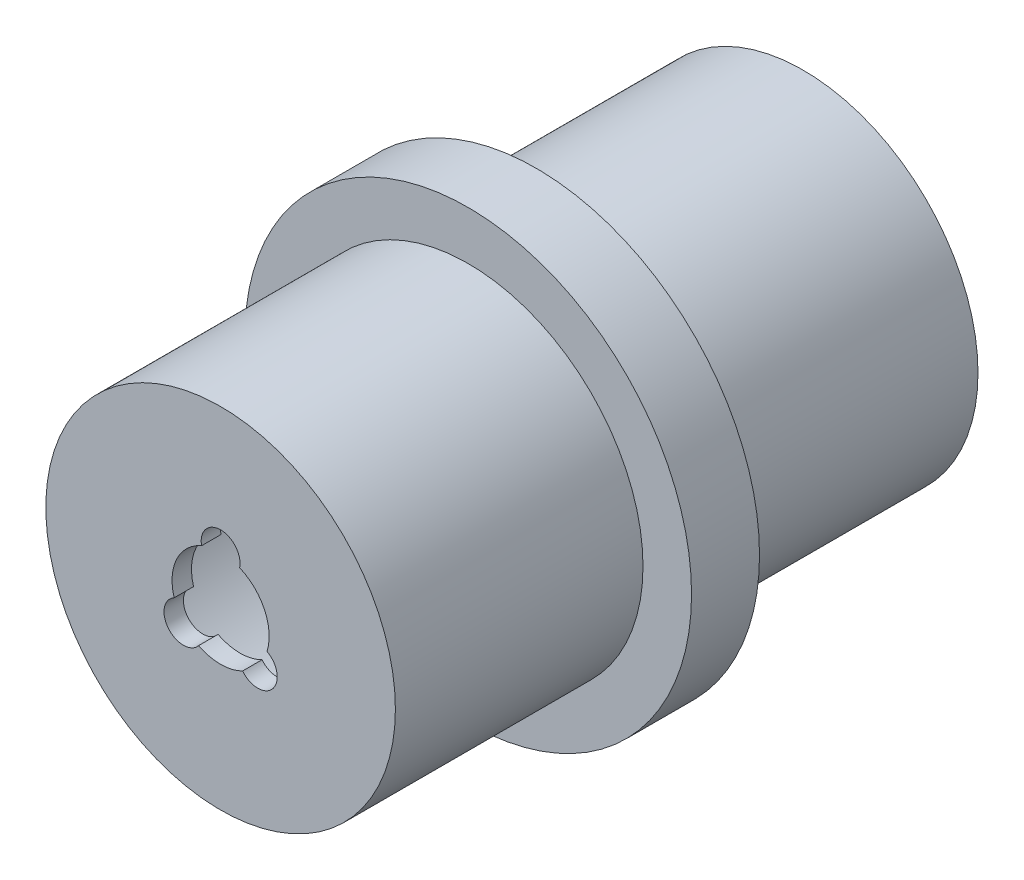
ISO-10303-21;
HEADER;
FILE_DESCRIPTION(('STEP AP214'),'2;1');
FILE_NAME('part.step','',(''),(''),'','','');
FILE_SCHEMA(('AUTOMOTIVE_DESIGN { 1 0 10303 214 1 1 1 1 }'));
ENDSEC;
DATA;
#1=APPLICATION_CONTEXT('core data for automotive mechanical design processes');
#2=APPLICATION_PROTOCOL_DEFINITION('international standard','automotive_design',2000,#1);
#3=PRODUCT_CONTEXT('',#1,'mechanical');
#4=PRODUCT('Part','Part','',(#3));
#5=PRODUCT_RELATED_PRODUCT_CATEGORY('part','',(#4));
#6=PRODUCT_DEFINITION_FORMATION('','',#4);
#7=PRODUCT_DEFINITION_CONTEXT('part definition',#1,'design');
#8=PRODUCT_DEFINITION('design','',#6,#7);
#9=PRODUCT_DEFINITION_SHAPE('','',#8);
#10=(LENGTH_UNIT() NAMED_UNIT(*) SI_UNIT(.MILLI.,.METRE.));
#11=(NAMED_UNIT(*) PLANE_ANGLE_UNIT() SI_UNIT($,.RADIAN.));
#12=(NAMED_UNIT(*) SI_UNIT($,.STERADIAN.) SOLID_ANGLE_UNIT());
#13=UNCERTAINTY_MEASURE_WITH_UNIT(LENGTH_MEASURE(1.E-05),#10,'distance_accuracy_value','');
#14=(GEOMETRIC_REPRESENTATION_CONTEXT(3) GLOBAL_UNCERTAINTY_ASSIGNED_CONTEXT((#13)) GLOBAL_UNIT_ASSIGNED_CONTEXT((#10,
#11,#12)) REPRESENTATION_CONTEXT('',''));
#15=CARTESIAN_POINT('',(0.,0.,0.));
#16=DIRECTION('',(0.,0.,1.));
#17=DIRECTION('',(1.,0.,0.));
#18=AXIS2_PLACEMENT_3D('',#15,#16,#17);
#19=CARTESIAN_POINT('',(0.,0.,1072.38147752167));
#20=DIRECTION('',(0.,0.,1.));
#21=DIRECTION('',(1.,0.,0.));
#22=AXIS2_PLACEMENT_3D('',#19,#20,#21);
#23=CYLINDRICAL_SURFACE('',#22,5.);
#24=CARTESIAN_POINT('',(0.,0.,58.));
#25=DIRECTION('',(0.,0.,1.));
#26=DIRECTION('',(1.,0.,0.));
#27=AXIS2_PLACEMENT_3D('',#24,#25,#26);
#28=CIRCLE('',#27,5.);
#29=CARTESIAN_POINT('',(-2.26420311297507,-4.45795740930687,58.));
#30=VERTEX_POINT('',#29);
#31=CARTESIAN_POINT('',(2.26420311297507,-4.45795740930687,58.));
#32=VERTEX_POINT('',#31);
#33=EDGE_CURVE('E283',#30,#32,#28,.T.);
#34=ORIENTED_EDGE('',*,*,#33,.F.);
#35=DIRECTION('',(0.,0.,1.));
#36=VECTOR('',#35,1.);
#37=CARTESIAN_POINT('',(-2.26420311297507,-4.45795740930687,-0.001000000000001));
#38=LINE('',#37,#36);
#39=CARTESIAN_POINT('',(-2.26420311297507,-4.45795740930687,60.));
#40=VERTEX_POINT('',#39);
#41=EDGE_CURVE('E107',#30,#40,#38,.T.);
#42=ORIENTED_EDGE('',*,*,#41,.T.);
#43=CARTESIAN_POINT('',(0.,0.,60.0000000000001));
#44=DIRECTION('',(0.,0.,1.));
#45=DIRECTION('',(1.,0.,0.));
#46=AXIS2_PLACEMENT_3D('',#43,#44,#45);
#47=CIRCLE('',#46,5.);
#48=CARTESIAN_POINT('',(2.26420311297507,-4.45795740930687,60.));
#49=VERTEX_POINT('',#48);
#50=EDGE_CURVE('E289',#40,#49,#47,.T.);
#51=ORIENTED_EDGE('',*,*,#50,.T.);
#52=DIRECTION('',(0.,0.,1.));
#53=VECTOR('',#52,1.);
#54=CARTESIAN_POINT('',(2.26420311297507,-4.45795740930687,-0.001000000000001));
#55=LINE('',#54,#53);
#56=EDGE_CURVE('E586',#32,#49,#55,.T.);
#57=ORIENTED_EDGE('',*,*,#56,.F.);
#58=EDGE_LOOP('',(#34,#42,#51,#57));
#59=FACE_BOUND('',#58,.T.);
#60=ADVANCED_FACE('F83',(#59),#23,.F.);
#61=CARTESIAN_POINT('',(-1.95959179422654,4.6,60.));
#62=VERTEX_POINT('',#61);
#63=CARTESIAN_POINT('',(-4.78340576371954,-1.45568859980928,60.));
#64=VERTEX_POINT('',#63);
#65=EDGE_CURVE('E273',#62,#64,#47,.T.);
#66=ORIENTED_EDGE('',*,*,#65,.T.);
#67=DIRECTION('',(0.,0.,1.));
#68=VECTOR('',#67,1.);
#69=CARTESIAN_POINT('',(-4.78340576371954,-1.45568859980928,-0.001000000000001));
#70=LINE('',#69,#68);
#71=CARTESIAN_POINT('',(-4.78340576371954,-1.45568859980928,58.));
#72=VERTEX_POINT('',#71);
#73=EDGE_CURVE('E257',#72,#64,#70,.T.);
#74=ORIENTED_EDGE('',*,*,#73,.F.);
#75=CARTESIAN_POINT('',(-1.95959179422654,4.6,58.));
#76=VERTEX_POINT('',#75);
#77=EDGE_CURVE('E271',#76,#72,#28,.T.);
#78=ORIENTED_EDGE('',*,*,#77,.F.);
#79=DIRECTION('',(0.,0.,1.));
#80=VECTOR('',#79,1.);
#81=CARTESIAN_POINT('',(-1.95959179422654,4.6,-0.001000000000001));
#82=LINE('',#81,#80);
#83=EDGE_CURVE('E596',#76,#62,#82,.T.);
#84=ORIENTED_EDGE('',*,*,#83,.T.);
#85=EDGE_LOOP('',(#66,#74,#78,#84));
#86=FACE_BOUND('',#85,.T.);
#87=ADVANCED_FACE('F269',(#86),#23,.F.);
#88=CARTESIAN_POINT('',(0.,0.,1072.38147752167));
#89=DIRECTION('',(0.,0.,1.));
#90=DIRECTION('',(1.,0.,0.));
#91=AXIS2_PLACEMENT_3D('',#88,#89,#90);
#92=CYLINDRICAL_SURFACE('',#91,17.);
#93=CARTESIAN_POINT('',(0.,0.,2.));
#94=DIRECTION('',(0.,0.,1.));
#95=DIRECTION('',(1.,0.,0.));
#96=AXIS2_PLACEMENT_3D('',#93,#94,#95);
#97=CIRCLE('',#96,17.);
#98=CARTESIAN_POINT('',(17.,0.,2.));
#99=VERTEX_POINT('',#98);
#100=EDGE_CURVE('E297',#99,#99,#97,.T.);
#101=ORIENTED_EDGE('',*,*,#100,.F.);
#102=EDGE_LOOP('',(#101));
#103=FACE_BOUND('',#102,.T.);
#104=CARTESIAN_POINT('',(0.,0.,30.));
#105=DIRECTION('',(0.,0.,1.));
#106=DIRECTION('',(1.,0.,0.));
#107=AXIS2_PLACEMENT_3D('',#104,#105,#106);
#108=CIRCLE('',#107,17.);
#109=CARTESIAN_POINT('',(-4.68395766336508,16.3419870458829,30.));
#110=VERTEX_POINT('',#109);
#111=CARTESIAN_POINT('',(4.68395766336508,16.3419870458829,30.));
#112=VERTEX_POINT('',#111);
#113=EDGE_CURVE('E418',#110,#112,#108,.F.);
#114=ORIENTED_EDGE('',*,*,#113,.F.);
#115=DIRECTION('',(0.,0.,1.));
#116=VECTOR('',#115,1.);
#117=CARTESIAN_POINT('',(-4.68395766336508,16.3419870458829,29.));
#118=LINE('',#117,#116);
#119=CARTESIAN_POINT('',(-4.68395766336508,16.3419870458829,29.));
#120=VERTEX_POINT('',#119);
#121=EDGE_CURVE('E342',#120,#110,#118,.T.);
#122=ORIENTED_EDGE('',*,*,#121,.F.);
#123=CARTESIAN_POINT('',(0.,0.,29.));
#124=DIRECTION('',(0.,0.,1.));
#125=DIRECTION('',(1.,0.,0.));
#126=AXIS2_PLACEMENT_3D('',#123,#124,#125);
#127=CIRCLE('',#126,17.);
#128=CARTESIAN_POINT('',(4.68395766336508,16.3419870458829,29.));
#129=VERTEX_POINT('',#128);
#130=EDGE_CURVE('E440',#120,#129,#127,.T.);
#131=ORIENTED_EDGE('',*,*,#130,.T.);
#132=DIRECTION('',(0.,0.,1.));
#133=VECTOR('',#132,1.);
#134=CARTESIAN_POINT('',(4.68395766336508,16.3419870458829,29.));
#135=LINE('',#134,#133);
#136=EDGE_CURVE('E337',#129,#112,#135,.T.);
#137=ORIENTED_EDGE('',*,*,#136,.T.);
#138=EDGE_LOOP('',(#114,#122,#131,#137));
#139=FACE_BOUND('',#138,.T.);
#140=ADVANCED_FACE('F650',(#103,#139),#92,.F.);
#141=CARTESIAN_POINT('',(0.,0.,29.));
#142=DIRECTION('',(0.939692620785896,-0.342020143325703,0.));
#143=DIRECTION('',(0.342020143325703,0.939692620785896,0.));
#144=AXIS2_PLACEMENT_3D('',#141,#142,#143);
#145=PLANE('',#144);
#146=DIRECTION('',(0.342020143325703,0.939692620785896,0.));
#147=VECTOR('',#146,1.);
#148=CARTESIAN_POINT('',(0.,0.,30.));
#149=LINE('',#148,#147);
#150=CARTESIAN_POINT('',(6.49838272318844,17.8541597949323,30.));
#151=VERTEX_POINT('',#150);
#152=CARTESIAN_POINT('',(7.52444315316555,20.67323765729,30.));
#153=VERTEX_POINT('',#152);
#154=EDGE_CURVE('E572',#151,#153,#149,.T.);
#155=ORIENTED_EDGE('',*,*,#154,.T.);
#156=DIRECTION('',(0.,0.,1.));
#157=VECTOR('',#156,1.);
#158=CARTESIAN_POINT('',(7.52444315316555,20.67323765729,29.));
#159=LINE('',#158,#157);
#160=CARTESIAN_POINT('',(7.52444315316555,20.67323765729,29.));
#161=VERTEX_POINT('',#160);
#162=EDGE_CURVE('E352',#161,#153,#159,.T.);
#163=ORIENTED_EDGE('',*,*,#162,.F.);
#164=DIRECTION('',(0.342020143325703,0.939692620785896,0.));
#165=VECTOR('',#164,1.);
#166=CARTESIAN_POINT('',(0.,0.,29.));
#167=LINE('',#166,#165);
#168=CARTESIAN_POINT('',(6.49838272318844,17.8541597949323,29.));
#169=VERTEX_POINT('',#168);
#170=EDGE_CURVE('E433',#169,#161,#167,.T.);
#171=ORIENTED_EDGE('',*,*,#170,.F.);
#172=DIRECTION('',(0.,0.,1.));
#173=VECTOR('',#172,1.);
#174=CARTESIAN_POINT('',(6.49838272318844,17.8541597949323,29.));
#175=LINE('',#174,#173);
#176=EDGE_CURVE('E320',#169,#151,#175,.T.);
#177=ORIENTED_EDGE('',*,*,#176,.T.);
#178=EDGE_LOOP('',(#155,#163,#171,#177));
#179=FACE_BOUND('',#178,.T.);
#180=ADVANCED_FACE('F714',(#179),#145,.F.);
#181=CARTESIAN_POINT('',(0.,0.,29.));
#182=DIRECTION('',(0.,0.,1.));
#183=DIRECTION('',(1.,0.,0.));
#184=AXIS2_PLACEMENT_3D('',#181,#182,#183);
#185=CYLINDRICAL_SURFACE('',#184,19.);
#186=DIRECTION('',(0.,0.,1.));
#187=VECTOR('',#186,1.);
#188=CARTESIAN_POINT('',(-6.49838272317903,17.8541597949354,29.));
#189=LINE('',#188,#187);
#190=CARTESIAN_POINT('',(-6.49838272317903,17.8541597949354,29.));
#191=VERTEX_POINT('',#190);
#192=CARTESIAN_POINT('',(-6.49838272317903,17.8541597949354,30.));
#193=VERTEX_POINT('',#192);
#194=EDGE_CURVE('E362',#191,#193,#189,.T.);
#195=ORIENTED_EDGE('',*,*,#194,.T.);
#196=CARTESIAN_POINT('',(0.,0.,30.));
#197=DIRECTION('',(0.,0.,1.));
#198=DIRECTION('',(1.,0.,0.));
#199=AXIS2_PLACEMENT_3D('',#196,#197,#198);
#200=CIRCLE('',#199,19.);
#201=EDGE_CURVE('E528',#151,#193,#200,.F.);
#202=ORIENTED_EDGE('',*,*,#201,.F.);
#203=ORIENTED_EDGE('',*,*,#176,.F.);
#204=CARTESIAN_POINT('',(0.,0.,29.));
#205=DIRECTION('',(0.,0.,1.));
#206=DIRECTION('',(1.,0.,0.));
#207=AXIS2_PLACEMENT_3D('',#204,#205,#206);
#208=CIRCLE('',#207,19.);
#209=EDGE_CURVE('E419',#169,#191,#208,.F.);
#210=ORIENTED_EDGE('',*,*,#209,.T.);
#211=EDGE_LOOP('',(#195,#202,#203,#210));
#212=FACE_BOUND('',#211,.T.);
#213=ADVANCED_FACE('F704',(#212),#185,.F.);
#214=CARTESIAN_POINT('',(6.36613778460758E-11,2.31708466085675E-11,29.));
#215=DIRECTION('',(0.939692620784855,0.342020143328563,0.));
#216=DIRECTION('',(-0.342020143328563,0.939692620784855,0.));
#217=AXIS2_PLACEMENT_3D('',#214,#215,#216);
#218=PLANE('',#217);
#219=DIRECTION('',(0.,0.,1.));
#220=VECTOR('',#219,1.);
#221=CARTESIAN_POINT('',(-7.52444315316472,20.67323765729,29.));
#222=LINE('',#221,#220);
#223=CARTESIAN_POINT('',(-7.52444315316472,20.67323765729,29.));
#224=VERTEX_POINT('',#223);
#225=CARTESIAN_POINT('',(-7.52444315316472,20.67323765729,30.));
#226=VERTEX_POINT('',#225);
#227=EDGE_CURVE('E357',#224,#226,#222,.T.);
#228=ORIENTED_EDGE('',*,*,#227,.T.);
#229=DIRECTION('',(-0.342020143328563,0.939692620784855,0.));
#230=VECTOR('',#229,1.);
#231=CARTESIAN_POINT('',(6.36613778460758E-11,2.31708466085675E-11,30.));
#232=LINE('',#231,#230);
#233=EDGE_CURVE('E559',#193,#226,#232,.T.);
#234=ORIENTED_EDGE('',*,*,#233,.F.);
#235=ORIENTED_EDGE('',*,*,#194,.F.);
#236=DIRECTION('',(-0.342020143328563,0.939692620784855,0.));
#237=VECTOR('',#236,1.);
#238=CARTESIAN_POINT('',(6.36613778460758E-11,2.31708466085675E-11,29.));
#239=LINE('',#238,#237);
#240=EDGE_CURVE('E426',#191,#224,#239,.T.);
#241=ORIENTED_EDGE('',*,*,#240,.T.);
#242=EDGE_LOOP('',(#228,#234,#235,#241));
#243=FACE_BOUND('',#242,.T.);
#244=ADVANCED_FACE('F708',(#243),#218,.T.);
#245=CARTESIAN_POINT('',(-1.,19.9724758914095,29.));
#246=CARTESIAN_POINT('',(-1.83751743884076,19.9724758914095,29.));
#247=CARTESIAN_POINT('',(-3.40070254752872,17.6066170470149,29.));
#248=CARTESIAN_POINT('',(-4.50524300138782,16.5181078502257,29.));
#249=B_SPLINE_CURVE_WITH_KNOTS('',3,(#245,#246,#247,#248),.UNSPECIFIED.,.F.,.F.,(4,4),(0.,1.),.UNSPECIFIED.);
#250=DIRECTION('',(0.,0.,1.));
#251=VECTOR('',#250,1.);
#252=SURFACE_OF_LINEAR_EXTRUSION('',#249,#251);
#253=DIRECTION('',(0.,0.,1.));
#254=VECTOR('',#253,1.);
#255=CARTESIAN_POINT('',(-4.50524300138782,16.5181078502257,29.));
#256=LINE('',#255,#254);
#257=CARTESIAN_POINT('',(-4.50524300138782,16.5181078502257,29.));
#258=VERTEX_POINT('',#257);
#259=CARTESIAN_POINT('',(-4.50524300138782,16.5181078502257,30.));
#260=VERTEX_POINT('',#259);
#261=EDGE_CURVE('E347',#258,#260,#256,.T.);
#262=ORIENTED_EDGE('',*,*,#261,.T.);
#263=CARTESIAN_POINT('',(-1.,19.9724758914095,30.));
#264=CARTESIAN_POINT('',(-1.83751743884076,19.9724758914095,30.));
#265=CARTESIAN_POINT('',(-3.40070254752872,17.6066170470149,30.));
#266=CARTESIAN_POINT('',(-4.50524300138782,16.5181078502257,30.));
#267=B_SPLINE_CURVE_WITH_KNOTS('',3,(#263,#264,#265,#266),.UNSPECIFIED.,.F.,.F.,(4,4),(0.,1.),.UNSPECIFIED.);
#268=CARTESIAN_POINT('',(-1.,19.9724758914095,30.));
#269=VERTEX_POINT('',#268);
#270=EDGE_CURVE('E531',#269,#260,#267,.T.);
#271=ORIENTED_EDGE('',*,*,#270,.F.);
#272=DIRECTION('',(0.,0.,1.));
#273=VECTOR('',#272,1.);
#274=CARTESIAN_POINT('',(-1.,19.9724758914095,29.));
#275=LINE('',#274,#273);
#276=CARTESIAN_POINT('',(-1.,19.9724758914095,29.));
#277=VERTEX_POINT('',#276);
#278=EDGE_CURVE('E321',#277,#269,#275,.T.);
#279=ORIENTED_EDGE('',*,*,#278,.F.);
#280=EDGE_CURVE('E374',#277,#258,#249,.T.);
#281=ORIENTED_EDGE('',*,*,#280,.T.);
#282=EDGE_LOOP('',(#262,#271,#279,#281));
#283=FACE_BOUND('',#282,.T.);
#284=ADVANCED_FACE('F481',(#283),#252,.T.);
#285=CARTESIAN_POINT('',(-10.4778611043263,10.6321760935121,29.));
#286=DIRECTION('',(-0.701919056131923,0.712256722424485,0.));
#287=DIRECTION('',(-0.712256722424485,-0.701919056131923,0.));
#288=AXIS2_PLACEMENT_3D('',#285,#286,#287);
#289=PLANE('',#288);
#290=ORIENTED_EDGE('',*,*,#121,.T.);
#291=DIRECTION('',(-0.712256722424485,-0.701919056131923,0.));
#292=VECTOR('',#291,1.);
#293=CARTESIAN_POINT('',(-10.4778611043263,10.6321760935121,30.));
#294=LINE('',#293,#292);
#295=EDGE_CURVE('E499',#260,#110,#294,.T.);
#296=ORIENTED_EDGE('',*,*,#295,.F.);
#297=ORIENTED_EDGE('',*,*,#261,.F.);
#298=DIRECTION('',(-0.712256722424485,-0.701919056131923,0.));
#299=VECTOR('',#298,1.);
#300=CARTESIAN_POINT('',(-10.4778611043263,10.6321760935121,29.));
#301=LINE('',#300,#299);
#302=EDGE_CURVE('E437',#258,#120,#301,.T.);
#303=ORIENTED_EDGE('',*,*,#302,.T.);
#304=EDGE_LOOP('',(#290,#296,#297,#303));
#305=FACE_BOUND('',#304,.T.);
#306=ADVANCED_FACE('F717',(#305),#289,.T.);
#307=CARTESIAN_POINT('',(10.4778611043263,10.6321760935121,29.));
#308=DIRECTION('',(-0.701919056131923,-0.712256722424485,0.));
#309=DIRECTION('',(0.712256722424485,-0.701919056131923,0.));
#310=AXIS2_PLACEMENT_3D('',#307,#308,#309);
#311=PLANE('',#310);
#312=DIRECTION('',(0.712256722424485,-0.701919056131923,0.));
#313=VECTOR('',#312,1.);
#314=CARTESIAN_POINT('',(10.4778611043263,10.6321760935121,30.));
#315=LINE('',#314,#313);
#316=CARTESIAN_POINT('',(4.50524300138782,16.5181078502257,30.));
#317=VERTEX_POINT('',#316);
#318=EDGE_CURVE('E504',#317,#112,#315,.T.);
#319=ORIENTED_EDGE('',*,*,#318,.T.);
#320=ORIENTED_EDGE('',*,*,#136,.F.);
#321=DIRECTION('',(0.712256722424485,-0.701919056131923,0.));
#322=VECTOR('',#321,1.);
#323=CARTESIAN_POINT('',(10.4778611043263,10.6321760935121,29.));
#324=LINE('',#323,#322);
#325=CARTESIAN_POINT('',(4.50524300138782,16.5181078502257,29.));
#326=VERTEX_POINT('',#325);
#327=EDGE_CURVE('E444',#326,#129,#324,.T.);
#328=ORIENTED_EDGE('',*,*,#327,.F.);
#329=DIRECTION('',(0.,0.,1.));
#330=VECTOR('',#329,1.);
#331=CARTESIAN_POINT('',(4.50524300138782,16.5181078502257,29.));
#332=LINE('',#331,#330);
#333=EDGE_CURVE('E332',#326,#317,#332,.T.);
#334=ORIENTED_EDGE('',*,*,#333,.T.);
#335=EDGE_LOOP('',(#319,#320,#328,#334));
#336=FACE_BOUND('',#335,.T.);
#337=ADVANCED_FACE('F722',(#336),#311,.F.);
#338=CARTESIAN_POINT('',(1.,19.9724758914095,29.));
#339=CARTESIAN_POINT('',(1.83751743884076,19.9724758914095,29.));
#340=CARTESIAN_POINT('',(3.40070254752872,17.6066170470149,29.));
#341=CARTESIAN_POINT('',(4.50524300138782,16.5181078502257,29.));
#342=B_SPLINE_CURVE_WITH_KNOTS('',3,(#338,#339,#340,#341),.UNSPECIFIED.,.F.,.F.,(4,4),(0.,1.),.UNSPECIFIED.);
#343=DIRECTION('',(0.,0.,1.));
#344=VECTOR('',#343,1.);
#345=SURFACE_OF_LINEAR_EXTRUSION('',#342,#344);
#346=CARTESIAN_POINT('',(1.,19.9724758914095,30.));
#347=CARTESIAN_POINT('',(1.83751743884076,19.9724758914095,30.));
#348=CARTESIAN_POINT('',(3.40070254752872,17.6066170470149,30.));
#349=CARTESIAN_POINT('',(4.50524300138782,16.5181078502257,30.));
#350=B_SPLINE_CURVE_WITH_KNOTS('',3,(#346,#347,#348,#349),.UNSPECIFIED.,.F.,.F.,(4,4),(0.,1.),.UNSPECIFIED.);
#351=CARTESIAN_POINT('',(1.,19.9724758914095,30.));
#352=VERTEX_POINT('',#351);
#353=EDGE_CURVE('E543',#352,#317,#350,.T.);
#354=ORIENTED_EDGE('',*,*,#353,.T.);
#355=ORIENTED_EDGE('',*,*,#333,.F.);
#356=CARTESIAN_POINT('',(1.,19.9724758914095,29.));
#357=VERTEX_POINT('',#356);
#358=EDGE_CURVE('E448',#357,#326,#342,.T.);
#359=ORIENTED_EDGE('',*,*,#358,.F.);
#360=DIRECTION('',(0.,0.,1.));
#361=VECTOR('',#360,1.);
#362=CARTESIAN_POINT('',(1.,19.9724758914095,29.));
#363=LINE('',#362,#361);
#364=EDGE_CURVE('E327',#357,#352,#363,.T.);
#365=ORIENTED_EDGE('',*,*,#364,.T.);
#366=EDGE_LOOP('',(#354,#355,#359,#365));
#367=FACE_BOUND('',#366,.T.);
#368=ADVANCED_FACE('F468',(#367),#345,.F.);
#369=CARTESIAN_POINT('',(0.,19.9724758914095,29.));
#370=DIRECTION('',(0.,-1.,0.));
#371=DIRECTION('',(1.,0.,0.));
#372=AXIS2_PLACEMENT_3D('',#369,#370,#371);
#373=PLANE('',#372);
#374=DIRECTION('',(1.,0.,0.));
#375=VECTOR('',#374,1.);
#376=CARTESIAN_POINT('',(0.,19.9724758914095,30.));
#377=LINE('',#376,#375);
#378=EDGE_CURVE('E536',#269,#352,#377,.T.);
#379=ORIENTED_EDGE('',*,*,#378,.T.);
#380=ORIENTED_EDGE('',*,*,#364,.F.);
#381=DIRECTION('',(1.,0.,0.));
#382=VECTOR('',#381,1.);
#383=CARTESIAN_POINT('',(0.,19.9724758914095,29.));
#384=LINE('',#383,#382);
#385=EDGE_CURVE('E455',#277,#357,#384,.T.);
#386=ORIENTED_EDGE('',*,*,#385,.F.);
#387=ORIENTED_EDGE('',*,*,#278,.T.);
#388=EDGE_LOOP('',(#379,#380,#386,#387));
#389=FACE_BOUND('',#388,.T.);
#390=ADVANCED_FACE('F474',(#389),#373,.F.);
#391=CARTESIAN_POINT('',(0.,0.,58.));
#392=DIRECTION('',(0.,0.,1.));
#393=DIRECTION('',(1.,0.,0.));
#394=AXIS2_PLACEMENT_3D('',#391,#392,#393);
#395=CIRCLE('',#394,17.);
#396=CARTESIAN_POINT('',(17.,0.,58.));
#397=VERTEX_POINT('',#396);
#398=EDGE_CURVE('E293',#397,#397,#395,.T.);
#399=ORIENTED_EDGE('',*,*,#398,.T.);
#400=EDGE_LOOP('',(#399));
#401=FACE_BOUND('',#400,.T.);
#402=CARTESIAN_POINT('',(-4.68395766336508,16.3419870458829,32.));
#403=VERTEX_POINT('',#402);
#404=CARTESIAN_POINT('',(-4.68395766336508,16.3419870458829,32.9999999999999));
#405=VERTEX_POINT('',#404);
#406=EDGE_CURVE('E341',#403,#405,#118,.T.);
#407=ORIENTED_EDGE('',*,*,#406,.F.);
#408=CARTESIAN_POINT('',(0.,0.,32.));
#409=DIRECTION('',(0.,0.,1.));
#410=DIRECTION('',(1.,0.,0.));
#411=AXIS2_PLACEMENT_3D('',#408,#409,#410);
#412=CIRCLE('',#411,17.);
#413=CARTESIAN_POINT('',(4.68395766336508,16.3419870458829,32.));
#414=VERTEX_POINT('',#413);
#415=EDGE_CURVE('E495',#403,#414,#412,.F.);
#416=ORIENTED_EDGE('',*,*,#415,.T.);
#417=CARTESIAN_POINT('',(4.68395766336508,16.3419870458829,33.));
#418=VERTEX_POINT('',#417);
#419=EDGE_CURVE('E336',#414,#418,#135,.T.);
#420=ORIENTED_EDGE('',*,*,#419,.T.);
#421=CARTESIAN_POINT('',(0.,0.,33.));
#422=DIRECTION('',(0.,0.,1.));
#423=DIRECTION('',(1.,0.,0.));
#424=AXIS2_PLACEMENT_3D('',#421,#422,#423);
#425=CIRCLE('',#424,17.);
#426=EDGE_CURVE('E391',#405,#418,#425,.T.);
#427=ORIENTED_EDGE('',*,*,#426,.F.);
#428=EDGE_LOOP('',(#407,#416,#420,#427));
#429=FACE_BOUND('',#428,.T.);
#430=ADVANCED_FACE('F642',(#401,#429),#92,.F.);
#431=CARTESIAN_POINT('',(0.,0.,27.5));
#432=DIRECTION('',(0.,0.,-1.));
#433=DIRECTION('',(-1.,0.,0.));
#434=AXIS2_PLACEMENT_3D('',#431,#432,#433);
#435=PLANE('',#434);
#436=CARTESIAN_POINT('',(0.,0.,27.5000000000001));
#437=DIRECTION('',(0.,0.,1.));
#438=DIRECTION('',(1.,0.,0.));
#439=AXIS2_PLACEMENT_3D('',#436,#437,#438);
#440=CIRCLE('',#439,18.);
#441=CARTESIAN_POINT('',(18.,0.,27.5000000000001));
#442=VERTEX_POINT('',#441);
#443=EDGE_CURVE('E316',#442,#442,#440,.T.);
#444=ORIENTED_EDGE('',*,*,#443,.T.);
#445=EDGE_LOOP('',(#444));
#446=FACE_BOUND('',#445,.T.);
#447=CARTESIAN_POINT('',(0.,0.,27.5000000000001));
#448=DIRECTION('',(0.,0.,1.));
#449=DIRECTION('',(1.,0.,0.));
#450=AXIS2_PLACEMENT_3D('',#447,#448,#449);
#451=CIRCLE('',#450,23.);
#452=CARTESIAN_POINT('',(23.,0.,27.5000000000001));
#453=VERTEX_POINT('',#452);
#454=EDGE_CURVE('E12',#453,#453,#451,.T.);
#455=ORIENTED_EDGE('',*,*,#454,.F.);
#456=EDGE_LOOP('',(#455));
#457=FACE_BOUND('',#456,.T.);
#458=ADVANCED_FACE('F85',(#446,#457),#435,.T.);
#459=CARTESIAN_POINT('',(0.,0.,1072.38147752167));
#460=DIRECTION('',(0.,0.,1.));
#461=DIRECTION('',(1.,0.,0.));
#462=AXIS2_PLACEMENT_3D('',#459,#460,#461);
#463=CYLINDRICAL_SURFACE('',#462,23.);
#464=ORIENTED_EDGE('',*,*,#454,.T.);
#465=EDGE_LOOP('',(#464));
#466=FACE_BOUND('',#465,.T.);
#467=CARTESIAN_POINT('',(0.,0.,34.5));
#468=DIRECTION('',(0.,0.,1.));
#469=DIRECTION('',(1.,0.,0.));
#470=AXIS2_PLACEMENT_3D('',#467,#468,#469);
#471=CIRCLE('',#470,23.);
#472=CARTESIAN_POINT('',(23.,0.,34.5));
#473=VERTEX_POINT('',#472);
#474=EDGE_CURVE('E92',#473,#473,#471,.T.);
#475=ORIENTED_EDGE('',*,*,#474,.F.);
#476=EDGE_LOOP('',(#475));
#477=FACE_BOUND('',#476,.T.);
#478=ADVANCED_FACE('F632',(#466,#477),#463,.T.);
#479=CARTESIAN_POINT('',(0.,0.,34.5));
#480=DIRECTION('',(0.,0.,-1.));
#481=DIRECTION('',(-1.,0.,0.));
#482=AXIS2_PLACEMENT_3D('',#479,#480,#481);
#483=PLANE('',#482);
#484=CARTESIAN_POINT('',(0.,0.,34.5));
#485=DIRECTION('',(0.,0.,1.));
#486=DIRECTION('',(1.,0.,0.));
#487=AXIS2_PLACEMENT_3D('',#484,#485,#486);
#488=CIRCLE('',#487,18.);
#489=CARTESIAN_POINT('',(18.,0.,34.5));
#490=VERTEX_POINT('',#489);
#491=EDGE_CURVE('E623',#490,#490,#488,.T.);
#492=ORIENTED_EDGE('',*,*,#491,.F.);
#493=EDGE_LOOP('',(#492));
#494=FACE_BOUND('',#493,.T.);
#495=ORIENTED_EDGE('',*,*,#474,.T.);
#496=EDGE_LOOP('',(#495));
#497=FACE_BOUND('',#496,.T.);
#498=ADVANCED_FACE('F630',(#494,#497),#483,.F.);
#499=CARTESIAN_POINT('',(0.,0.,1072.38147752167));
#500=DIRECTION('',(0.,0.,1.));
#501=DIRECTION('',(1.,0.,0.));
#502=AXIS2_PLACEMENT_3D('',#499,#500,#501);
#503=CYLINDRICAL_SURFACE('',#502,18.);
#504=ORIENTED_EDGE('',*,*,#491,.T.);
#505=EDGE_LOOP('',(#504));
#506=FACE_BOUND('',#505,.T.);
#507=CARTESIAN_POINT('',(0.,0.,60.0000000000001));
#508=DIRECTION('',(0.,0.,1.));
#509=DIRECTION('',(1.,0.,0.));
#510=AXIS2_PLACEMENT_3D('',#507,#508,#509);
#511=CIRCLE('',#510,18.);
#512=CARTESIAN_POINT('',(18.,0.,60.0000000000001));
#513=VERTEX_POINT('',#512);
#514=EDGE_CURVE('E618',#513,#513,#511,.T.);
#515=ORIENTED_EDGE('',*,*,#514,.F.);
#516=EDGE_LOOP('',(#515));
#517=FACE_BOUND('',#516,.T.);
#518=ADVANCED_FACE('F639',(#506,#517),#503,.T.);
#519=CARTESIAN_POINT('',(0.,0.,60.));
#520=DIRECTION('',(0.,0.,1.));
#521=DIRECTION('',(1.,0.,0.));
#522=AXIS2_PLACEMENT_3D('',#519,#520,#521);
#523=PLANE('',#522);
#524=CARTESIAN_POINT('',(-3.8302222155949,-3.21393804843269,60.));
#525=DIRECTION('',(0.,0.,1.));
#526=DIRECTION('',(1.,0.,0.));
#527=AXIS2_PLACEMENT_3D('',#524,#525,#526);
#528=CIRCLE('',#527,2.);
#529=EDGE_CURVE('E275',#64,#40,#528,.T.);
#530=ORIENTED_EDGE('',*,*,#529,.F.);
#531=ORIENTED_EDGE('',*,*,#65,.F.);
#532=CARTESIAN_POINT('',(0.,5.,60.));
#533=DIRECTION('',(0.,0.,1.));
#534=DIRECTION('',(1.,0.,0.));
#535=AXIS2_PLACEMENT_3D('',#532,#533,#534);
#536=CIRCLE('',#535,2.);
#537=CARTESIAN_POINT('',(1.95959179422654,4.6,60.));
#538=VERTEX_POINT('',#537);
#539=EDGE_CURVE('E585',#538,#62,#536,.T.);
#540=ORIENTED_EDGE('',*,*,#539,.F.);
#541=CARTESIAN_POINT('',(4.78340576371954,-1.45568859980928,60.));
#542=VERTEX_POINT('',#541);
#543=EDGE_CURVE('E282',#542,#538,#47,.T.);
#544=ORIENTED_EDGE('',*,*,#543,.F.);
#545=CARTESIAN_POINT('',(3.8302222155949,-3.21393804843269,60.));
#546=DIRECTION('',(0.,0.,1.));
#547=DIRECTION('',(1.,0.,0.));
#548=AXIS2_PLACEMENT_3D('',#545,#546,#547);
#549=CIRCLE('',#548,2.);
#550=EDGE_CURVE('E589',#49,#542,#549,.T.);
#551=ORIENTED_EDGE('',*,*,#550,.F.);
#552=ORIENTED_EDGE('',*,*,#50,.F.);
#553=EDGE_LOOP('',(#530,#531,#540,#544,#551,#552));
#554=FACE_BOUND('',#553,.T.);
#555=ORIENTED_EDGE('',*,*,#514,.T.);
#556=EDGE_LOOP('',(#555));
#557=FACE_BOUND('',#556,.T.);
#558=ADVANCED_FACE('F613',(#554,#557),#523,.T.);
#559=ORIENTED_EDGE('',*,*,#543,.T.);
#560=DIRECTION('',(0.,0.,1.));
#561=VECTOR('',#560,1.);
#562=CARTESIAN_POINT('',(1.95959179422654,4.6,-0.001000000000001));
#563=LINE('',#562,#561);
#564=CARTESIAN_POINT('',(1.95959179422654,4.6,58.));
#565=VERTEX_POINT('',#564);
#566=EDGE_CURVE('E597',#565,#538,#563,.T.);
#567=ORIENTED_EDGE('',*,*,#566,.F.);
#568=CARTESIAN_POINT('',(4.78340576371954,-1.45568859980928,58.));
#569=VERTEX_POINT('',#568);
#570=EDGE_CURVE('E285',#569,#565,#28,.T.);
#571=ORIENTED_EDGE('',*,*,#570,.F.);
#572=DIRECTION('',(0.,0.,1.));
#573=VECTOR('',#572,1.);
#574=CARTESIAN_POINT('',(4.78340576371954,-1.45568859980928,-0.001000000000001));
#575=LINE('',#574,#573);
#576=EDGE_CURVE('E99',#569,#542,#575,.T.);
#577=ORIENTED_EDGE('',*,*,#576,.T.);
#578=EDGE_LOOP('',(#559,#567,#571,#577));
#579=FACE_BOUND('',#578,.T.);
#580=ADVANCED_FACE('F646',(#579),#23,.F.);
#581=CARTESIAN_POINT('',(0.,0.,58.));
#582=DIRECTION('',(0.,0.,1.));
#583=DIRECTION('',(1.,0.,0.));
#584=AXIS2_PLACEMENT_3D('',#581,#582,#583);
#585=PLANE('',#584);
#586=ORIENTED_EDGE('',*,*,#398,.F.);
#587=EDGE_LOOP('',(#586));
#588=FACE_BOUND('',#587,.T.);
#589=ORIENTED_EDGE('',*,*,#77,.T.);
#590=CARTESIAN_POINT('',(-3.8302222155949,-3.21393804843269,58.));
#591=DIRECTION('',(0.,0.,1.));
#592=DIRECTION('',(1.,0.,0.));
#593=AXIS2_PLACEMENT_3D('',#590,#591,#592);
#594=CIRCLE('',#593,2.);
#595=EDGE_CURVE('E254',#30,#72,#594,.F.);
#596=ORIENTED_EDGE('',*,*,#595,.F.);
#597=ORIENTED_EDGE('',*,*,#33,.T.);
#598=CARTESIAN_POINT('',(3.8302222155949,-3.21393804843269,58.));
#599=DIRECTION('',(0.,0.,1.));
#600=DIRECTION('',(1.,0.,0.));
#601=AXIS2_PLACEMENT_3D('',#598,#599,#600);
#602=CIRCLE('',#601,2.);
#603=EDGE_CURVE('E582',#569,#32,#602,.F.);
#604=ORIENTED_EDGE('',*,*,#603,.F.);
#605=ORIENTED_EDGE('',*,*,#570,.T.);
#606=CARTESIAN_POINT('',(0.,5.,58.));
#607=DIRECTION('',(0.,0.,1.));
#608=DIRECTION('',(1.,0.,0.));
#609=AXIS2_PLACEMENT_3D('',#606,#607,#608);
#610=CIRCLE('',#609,2.);
#611=EDGE_CURVE('E280',#76,#565,#610,.F.);
#612=ORIENTED_EDGE('',*,*,#611,.F.);
#613=EDGE_LOOP('',(#589,#596,#597,#604,#605,#612));
#614=FACE_BOUND('',#613,.T.);
#615=ADVANCED_FACE('F278',(#588,#614),#585,.F.);
#616=CARTESIAN_POINT('',(0.,0.,2.));
#617=DIRECTION('',(0.,0.,1.));
#618=DIRECTION('',(1.,0.,0.));
#619=AXIS2_PLACEMENT_3D('',#616,#617,#618);
#620=PLANE('',#619);
#621=ORIENTED_EDGE('',*,*,#100,.T.);
#622=EDGE_LOOP('',(#621));
#623=FACE_BOUND('',#622,.T.);
#624=CARTESIAN_POINT('',(0.,0.,2.));
#625=DIRECTION('',(0.,0.,1.));
#626=DIRECTION('',(1.,0.,0.));
#627=AXIS2_PLACEMENT_3D('',#624,#625,#626);
#628=CIRCLE('',#627,13.);
#629=CARTESIAN_POINT('',(13.,0.,2.));
#630=VERTEX_POINT('',#629);
#631=EDGE_CURVE('E302',#630,#630,#628,.T.);
#632=ORIENTED_EDGE('',*,*,#631,.F.);
#633=EDGE_LOOP('',(#632));
#634=FACE_BOUND('',#633,.T.);
#635=ADVANCED_FACE('F659',(#623,#634),#620,.T.);
#636=CARTESIAN_POINT('',(0.,0.,1072.38147752167));
#637=DIRECTION('',(0.,0.,1.));
#638=DIRECTION('',(1.,0.,0.));
#639=AXIS2_PLACEMENT_3D('',#636,#637,#638);
#640=CYLINDRICAL_SURFACE('',#639,13.);
#641=CARTESIAN_POINT('',(0.,0.,0.));
#642=DIRECTION('',(0.,0.,1.));
#643=DIRECTION('',(1.,0.,0.));
#644=AXIS2_PLACEMENT_3D('',#641,#642,#643);
#645=CIRCLE('',#644,13.);
#646=CARTESIAN_POINT('',(13.,0.,0.));
#647=VERTEX_POINT('',#646);
#648=EDGE_CURVE('E308',#647,#647,#645,.T.);
#649=ORIENTED_EDGE('',*,*,#648,.F.);
#650=EDGE_LOOP('',(#649));
#651=FACE_BOUND('',#650,.T.);
#652=ORIENTED_EDGE('',*,*,#631,.T.);
#653=EDGE_LOOP('',(#652));
#654=FACE_BOUND('',#653,.T.);
#655=ADVANCED_FACE('F883',(#651,#654),#640,.F.);
#656=CARTESIAN_POINT('',(0.,0.,0.));
#657=DIRECTION('',(0.,0.,1.));
#658=DIRECTION('',(1.,0.,0.));
#659=AXIS2_PLACEMENT_3D('',#656,#657,#658);
#660=PLANE('',#659);
#661=CARTESIAN_POINT('',(0.,0.,0.));
#662=DIRECTION('',(0.,0.,1.));
#663=DIRECTION('',(1.,0.,0.));
#664=AXIS2_PLACEMENT_3D('',#661,#662,#663);
#665=CIRCLE('',#664,18.);
#666=CARTESIAN_POINT('',(18.,0.,0.));
#667=VERTEX_POINT('',#666);
#668=EDGE_CURVE('E312',#667,#667,#665,.T.);
#669=ORIENTED_EDGE('',*,*,#668,.F.);
#670=EDGE_LOOP('',(#669));
#671=FACE_BOUND('',#670,.T.);
#672=ORIENTED_EDGE('',*,*,#648,.T.);
#673=EDGE_LOOP('',(#672));
#674=FACE_BOUND('',#673,.T.);
#675=ADVANCED_FACE('F873',(#671,#674),#660,.F.);
#676=CARTESIAN_POINT('',(0.,0.,1072.38147752167));
#677=DIRECTION('',(0.,0.,1.));
#678=DIRECTION('',(1.,0.,0.));
#679=AXIS2_PLACEMENT_3D('',#676,#677,#678);
#680=CYLINDRICAL_SURFACE('',#679,18.);
#681=ORIENTED_EDGE('',*,*,#668,.T.);
#682=EDGE_LOOP('',(#681));
#683=FACE_BOUND('',#682,.T.);
#684=ORIENTED_EDGE('',*,*,#443,.F.);
#685=EDGE_LOOP('',(#684));
#686=FACE_BOUND('',#685,.T.);
#687=ADVANCED_FACE('F482',(#683,#686),#680,.T.);
#688=CARTESIAN_POINT('',(7.52444315316555,20.67323765729,32.));
#689=VERTEX_POINT('',#688);
#690=CARTESIAN_POINT('',(7.52444315316555,20.67323765729,33.));
#691=VERTEX_POINT('',#690);
#692=EDGE_CURVE('E351',#689,#691,#159,.T.);
#693=ORIENTED_EDGE('',*,*,#692,.F.);
#694=DIRECTION('',(0.342020143325703,0.939692620785896,0.));
#695=VECTOR('',#694,1.);
#696=CARTESIAN_POINT('',(0.,0.,32.));
#697=LINE('',#696,#695);
#698=CARTESIAN_POINT('',(6.49838272318844,17.8541597949323,32.));
#699=VERTEX_POINT('',#698);
#700=EDGE_CURVE('E560',#699,#689,#697,.T.);
#701=ORIENTED_EDGE('',*,*,#700,.F.);
#702=CARTESIAN_POINT('',(6.49838272318844,17.8541597949323,33.));
#703=VERTEX_POINT('',#702);
#704=EDGE_CURVE('E366',#699,#703,#175,.T.);
#705=ORIENTED_EDGE('',*,*,#704,.T.);
#706=DIRECTION('',(0.342020143325703,0.939692620785896,0.));
#707=VECTOR('',#706,1.);
#708=CARTESIAN_POINT('',(0.,0.,33.));
#709=LINE('',#708,#707);
#710=EDGE_CURVE('E383',#703,#691,#709,.T.);
#711=ORIENTED_EDGE('',*,*,#710,.T.);
#712=EDGE_LOOP('',(#693,#701,#705,#711));
#713=FACE_BOUND('',#712,.T.);
#714=ADVANCED_FACE('F702',(#713),#145,.F.);
#715=CARTESIAN_POINT('',(0.,0.,32.));
#716=DIRECTION('',(0.,0.,1.));
#717=DIRECTION('',(1.,0.,0.));
#718=AXIS2_PLACEMENT_3D('',#715,#716,#717);
#719=CIRCLE('',#718,19.);
#720=CARTESIAN_POINT('',(-6.49838272317903,17.8541597949354,32.));
#721=VERTEX_POINT('',#720);
#722=EDGE_CURVE('E555',#699,#721,#719,.F.);
#723=ORIENTED_EDGE('',*,*,#722,.T.);
#724=CARTESIAN_POINT('',(-6.49838272317903,17.8541597949354,33.));
#725=VERTEX_POINT('',#724);
#726=EDGE_CURVE('E361',#721,#725,#189,.T.);
#727=ORIENTED_EDGE('',*,*,#726,.T.);
#728=CARTESIAN_POINT('',(0.,0.,33.));
#729=DIRECTION('',(0.,0.,1.));
#730=DIRECTION('',(1.,0.,0.));
#731=AXIS2_PLACEMENT_3D('',#728,#729,#730);
#732=CIRCLE('',#731,19.);
#733=EDGE_CURVE('E370',#703,#725,#732,.F.);
#734=ORIENTED_EDGE('',*,*,#733,.F.);
#735=ORIENTED_EDGE('',*,*,#704,.F.);
#736=EDGE_LOOP('',(#723,#727,#734,#735));
#737=FACE_BOUND('',#736,.T.);
#738=ADVANCED_FACE('F699',(#737),#185,.F.);
#739=DIRECTION('',(-0.342020143328563,0.939692620784855,0.));
#740=VECTOR('',#739,1.);
#741=CARTESIAN_POINT('',(6.36613778460758E-11,2.31708466085675E-11,32.));
#742=LINE('',#741,#740);
#743=CARTESIAN_POINT('',(-7.52444315316472,20.67323765729,32.));
#744=VERTEX_POINT('',#743);
#745=EDGE_CURVE('E264',#721,#744,#742,.T.);
#746=ORIENTED_EDGE('',*,*,#745,.T.);
#747=CARTESIAN_POINT('',(-7.52444315316472,20.67323765729,33.));
#748=VERTEX_POINT('',#747);
#749=EDGE_CURVE('E356',#744,#748,#222,.T.);
#750=ORIENTED_EDGE('',*,*,#749,.T.);
#751=DIRECTION('',(-0.342020143328563,0.939692620784855,0.));
#752=VECTOR('',#751,1.);
#753=CARTESIAN_POINT('',(6.36613778460758E-11,2.31708466085675E-11,33.));
#754=LINE('',#753,#752);
#755=EDGE_CURVE('E375',#725,#748,#754,.T.);
#756=ORIENTED_EDGE('',*,*,#755,.F.);
#757=ORIENTED_EDGE('',*,*,#726,.F.);
#758=EDGE_LOOP('',(#746,#750,#756,#757));
#759=FACE_BOUND('',#758,.T.);
#760=ADVANCED_FACE('F479',(#759),#218,.T.);
#761=CARTESIAN_POINT('',(-1.,19.9724758914095,32.));
#762=CARTESIAN_POINT('',(-1.83751743884076,19.9724758914095,32.));
#763=CARTESIAN_POINT('',(-3.40070254752872,17.6066170470149,32.));
#764=CARTESIAN_POINT('',(-4.50524300138782,16.5181078502257,32.));
#765=B_SPLINE_CURVE_WITH_KNOTS('',3,(#761,#762,#763,#764),.UNSPECIFIED.,.F.,.F.,(4,4),(0.,1.),.UNSPECIFIED.);
#766=CARTESIAN_POINT('',(-1.,19.9724758914095,32.));
#767=VERTEX_POINT('',#766);
#768=CARTESIAN_POINT('',(-4.50524300138782,16.5181078502257,32.));
#769=VERTEX_POINT('',#768);
#770=EDGE_CURVE('E505',#767,#769,#765,.T.);
#771=ORIENTED_EDGE('',*,*,#770,.T.);
#772=CARTESIAN_POINT('',(-4.50524300138782,16.5181078502257,33.));
#773=VERTEX_POINT('',#772);
#774=EDGE_CURVE('E346',#769,#773,#256,.T.);
#775=ORIENTED_EDGE('',*,*,#774,.T.);
#776=CARTESIAN_POINT('',(-1.,19.9724758914095,33.));
#777=CARTESIAN_POINT('',(-1.83751743884076,19.9724758914095,33.));
#778=CARTESIAN_POINT('',(-3.40070254752872,17.6066170470149,33.));
#779=CARTESIAN_POINT('',(-4.50524300138782,16.5181078502257,33.));
#780=B_SPLINE_CURVE_WITH_KNOTS('',3,(#776,#777,#778,#779),.UNSPECIFIED.,.F.,.F.,(4,4),(0.,1.),.UNSPECIFIED.);
#781=CARTESIAN_POINT('',(-1.,19.9724758914095,33.));
#782=VERTEX_POINT('',#781);
#783=EDGE_CURVE('E412',#782,#773,#780,.T.);
#784=ORIENTED_EDGE('',*,*,#783,.F.);
#785=EDGE_CURVE('E326',#767,#782,#275,.T.);
#786=ORIENTED_EDGE('',*,*,#785,.F.);
#787=EDGE_LOOP('',(#771,#775,#784,#786));
#788=FACE_BOUND('',#787,.T.);
#789=ADVANCED_FACE('F475',(#788),#252,.T.);
#790=DIRECTION('',(-0.712256722424485,-0.701919056131923,0.));
#791=VECTOR('',#790,1.);
#792=CARTESIAN_POINT('',(-10.4778611043263,10.6321760935121,32.));
#793=LINE('',#792,#791);
#794=EDGE_CURVE('E500',#769,#403,#793,.T.);
#795=ORIENTED_EDGE('',*,*,#794,.T.);
#796=ORIENTED_EDGE('',*,*,#406,.T.);
#797=DIRECTION('',(-0.712256722424485,-0.701919056131923,0.));
#798=VECTOR('',#797,1.);
#799=CARTESIAN_POINT('',(-10.4778611043263,10.6321760935121,33.));
#800=LINE('',#799,#798);
#801=EDGE_CURVE('E387',#773,#405,#800,.T.);
#802=ORIENTED_EDGE('',*,*,#801,.F.);
#803=ORIENTED_EDGE('',*,*,#774,.F.);
#804=EDGE_LOOP('',(#795,#796,#802,#803));
#805=FACE_BOUND('',#804,.T.);
#806=ADVANCED_FACE('F478',(#805),#289,.T.);
#807=ORIENTED_EDGE('',*,*,#419,.F.);
#808=DIRECTION('',(0.712256722424485,-0.701919056131923,0.));
#809=VECTOR('',#808,1.);
#810=CARTESIAN_POINT('',(10.4778611043263,10.6321760935121,32.));
#811=LINE('',#810,#809);
#812=CARTESIAN_POINT('',(4.50524300138782,16.5181078502257,32.));
#813=VERTEX_POINT('',#812);
#814=EDGE_CURVE('E522',#813,#414,#811,.T.);
#815=ORIENTED_EDGE('',*,*,#814,.F.);
#816=CARTESIAN_POINT('',(4.50524300138782,16.5181078502257,33.));
#817=VERTEX_POINT('',#816);
#818=EDGE_CURVE('E331',#813,#817,#332,.T.);
#819=ORIENTED_EDGE('',*,*,#818,.T.);
#820=DIRECTION('',(0.712256722424485,-0.701919056131923,0.));
#821=VECTOR('',#820,1.);
#822=CARTESIAN_POINT('',(10.4778611043263,10.6321760935121,33.));
#823=LINE('',#822,#821);
#824=EDGE_CURVE('E395',#817,#418,#823,.T.);
#825=ORIENTED_EDGE('',*,*,#824,.T.);
#826=EDGE_LOOP('',(#807,#815,#819,#825));
#827=FACE_BOUND('',#826,.T.);
#828=ADVANCED_FACE('F466',(#827),#311,.F.);
#829=ORIENTED_EDGE('',*,*,#818,.F.);
#830=CARTESIAN_POINT('',(1.,19.9724758914095,32.));
#831=CARTESIAN_POINT('',(1.83751743884076,19.9724758914095,32.));
#832=CARTESIAN_POINT('',(3.40070254752872,17.6066170470149,32.));
#833=CARTESIAN_POINT('',(4.50524300138782,16.5181078502257,32.));
#834=B_SPLINE_CURVE_WITH_KNOTS('',3,(#830,#831,#832,#833),.UNSPECIFIED.,.F.,.F.,(4,4),(0.,1.),.UNSPECIFIED.);
#835=CARTESIAN_POINT('',(1.,19.9724758914095,32.));
#836=VERTEX_POINT('',#835);
#837=EDGE_CURVE('E517',#836,#813,#834,.T.);
#838=ORIENTED_EDGE('',*,*,#837,.F.);
#839=CARTESIAN_POINT('',(1.,19.9724758914095,33.));
#840=VERTEX_POINT('',#839);
#841=EDGE_CURVE('E325',#836,#840,#363,.T.);
#842=ORIENTED_EDGE('',*,*,#841,.T.);
#843=CARTESIAN_POINT('',(1.,19.9724758914095,33.));
#844=CARTESIAN_POINT('',(1.83751743884076,19.9724758914095,33.));
#845=CARTESIAN_POINT('',(3.40070254752872,17.6066170470149,33.));
#846=CARTESIAN_POINT('',(4.50524300138782,16.5181078502257,33.));
#847=B_SPLINE_CURVE_WITH_KNOTS('',3,(#843,#844,#845,#846),.UNSPECIFIED.,.F.,.F.,(4,4),(0.,1.),.UNSPECIFIED.);
#848=EDGE_CURVE('E399',#840,#817,#847,.T.);
#849=ORIENTED_EDGE('',*,*,#848,.T.);
#850=EDGE_LOOP('',(#829,#838,#842,#849));
#851=FACE_BOUND('',#850,.T.);
#852=ADVANCED_FACE('F461',(#851),#345,.F.);
#853=ORIENTED_EDGE('',*,*,#841,.F.);
#854=DIRECTION('',(1.,0.,0.));
#855=VECTOR('',#854,1.);
#856=CARTESIAN_POINT('',(0.,19.9724758914095,32.));
#857=LINE('',#856,#855);
#858=EDGE_CURVE('E511',#767,#836,#857,.T.);
#859=ORIENTED_EDGE('',*,*,#858,.F.);
#860=ORIENTED_EDGE('',*,*,#785,.T.);
#861=DIRECTION('',(1.,0.,0.));
#862=VECTOR('',#861,1.);
#863=CARTESIAN_POINT('',(0.,19.9724758914095,33.));
#864=LINE('',#863,#862);
#865=EDGE_CURVE('E405',#782,#840,#864,.T.);
#866=ORIENTED_EDGE('',*,*,#865,.T.);
#867=EDGE_LOOP('',(#853,#859,#860,#866));
#868=FACE_BOUND('',#867,.T.);
#869=ADVANCED_FACE('F465',(#868),#373,.F.);
#870=CARTESIAN_POINT('',(0.,0.,29.));
#871=DIRECTION('',(0.,0.,1.));
#872=DIRECTION('',(1.,0.,0.));
#873=AXIS2_PLACEMENT_3D('',#870,#871,#872);
#874=CYLINDRICAL_SURFACE('',#873,22.);
#875=ORIENTED_EDGE('',*,*,#749,.F.);
#876=CARTESIAN_POINT('',(0.,0.,32.));
#877=DIRECTION('',(0.,0.,1.));
#878=DIRECTION('',(1.,0.,0.));
#879=AXIS2_PLACEMENT_3D('',#876,#877,#878);
#880=CIRCLE('',#879,22.);
#881=EDGE_CURVE('E564',#744,#689,#880,.T.);
#882=ORIENTED_EDGE('',*,*,#881,.T.);
#883=ORIENTED_EDGE('',*,*,#692,.T.);
#884=CARTESIAN_POINT('',(0.,0.,33.));
#885=DIRECTION('',(0.,0.,1.));
#886=DIRECTION('',(1.,0.,0.));
#887=AXIS2_PLACEMENT_3D('',#884,#885,#886);
#888=CIRCLE('',#887,22.);
#889=EDGE_CURVE('E379',#691,#748,#888,.T.);
#890=ORIENTED_EDGE('',*,*,#889,.T.);
#891=EDGE_LOOP('',(#875,#882,#883,#890));
#892=FACE_BOUND('',#891,.T.);
#893=CARTESIAN_POINT('',(0.,0.,30.));
#894=DIRECTION('',(0.,0.,1.));
#895=DIRECTION('',(1.,0.,0.));
#896=AXIS2_PLACEMENT_3D('',#893,#894,#895);
#897=CIRCLE('',#896,22.);
#898=EDGE_CURVE('E576',#226,#153,#897,.T.);
#899=ORIENTED_EDGE('',*,*,#898,.F.);
#900=ORIENTED_EDGE('',*,*,#227,.F.);
#901=CARTESIAN_POINT('',(0.,0.,29.));
#902=DIRECTION('',(0.,0.,1.));
#903=DIRECTION('',(1.,0.,0.));
#904=AXIS2_PLACEMENT_3D('',#901,#902,#903);
#905=CIRCLE('',#904,22.);
#906=EDGE_CURVE('E429',#161,#224,#905,.T.);
#907=ORIENTED_EDGE('',*,*,#906,.F.);
#908=ORIENTED_EDGE('',*,*,#162,.T.);
#909=EDGE_LOOP('',(#899,#900,#907,#908));
#910=FACE_BOUND('',#909,.T.);
#911=ADVANCED_FACE('F472',(#892,#910),#874,.F.);
#912=CARTESIAN_POINT('',(0.,0.,29.));
#913=DIRECTION('',(0.,0.,1.));
#914=DIRECTION('',(1.,0.,0.));
#915=AXIS2_PLACEMENT_3D('',#912,#913,#914);
#916=PLANE('',#915);
#917=ORIENTED_EDGE('',*,*,#280,.F.);
#918=ORIENTED_EDGE('',*,*,#385,.T.);
#919=ORIENTED_EDGE('',*,*,#358,.T.);
#920=ORIENTED_EDGE('',*,*,#327,.T.);
#921=ORIENTED_EDGE('',*,*,#130,.F.);
#922=ORIENTED_EDGE('',*,*,#302,.F.);
#923=EDGE_LOOP('',(#917,#918,#919,#920,#921,#922));
#924=FACE_BOUND('',#923,.T.);
#925=ORIENTED_EDGE('',*,*,#170,.T.);
#926=ORIENTED_EDGE('',*,*,#906,.T.);
#927=ORIENTED_EDGE('',*,*,#240,.F.);
#928=ORIENTED_EDGE('',*,*,#209,.F.);
#929=EDGE_LOOP('',(#925,#926,#927,#928));
#930=FACE_BOUND('',#929,.T.);
#931=ADVANCED_FACE('F692',(#924,#930),#916,.T.);
#932=CARTESIAN_POINT('',(0.,0.,33.));
#933=DIRECTION('',(0.,0.,1.));
#934=DIRECTION('',(1.,0.,0.));
#935=AXIS2_PLACEMENT_3D('',#932,#933,#934);
#936=PLANE('',#935);
#937=ORIENTED_EDGE('',*,*,#783,.T.);
#938=ORIENTED_EDGE('',*,*,#801,.T.);
#939=ORIENTED_EDGE('',*,*,#426,.T.);
#940=ORIENTED_EDGE('',*,*,#824,.F.);
#941=ORIENTED_EDGE('',*,*,#848,.F.);
#942=ORIENTED_EDGE('',*,*,#865,.F.);
#943=EDGE_LOOP('',(#937,#938,#939,#940,#941,#942));
#944=FACE_BOUND('',#943,.T.);
#945=ORIENTED_EDGE('',*,*,#710,.F.);
#946=ORIENTED_EDGE('',*,*,#733,.T.);
#947=ORIENTED_EDGE('',*,*,#755,.T.);
#948=ORIENTED_EDGE('',*,*,#889,.F.);
#949=EDGE_LOOP('',(#945,#946,#947,#948));
#950=FACE_BOUND('',#949,.T.);
#951=ADVANCED_FACE('F680',(#944,#950),#936,.F.);
#952=CARTESIAN_POINT('',(0.,0.,30.));
#953=DIRECTION('',(0.,0.,1.));
#954=DIRECTION('',(1.,0.,0.));
#955=AXIS2_PLACEMENT_3D('',#952,#953,#954);
#956=PLANE('',#955);
#957=ORIENTED_EDGE('',*,*,#233,.T.);
#958=ORIENTED_EDGE('',*,*,#898,.T.);
#959=ORIENTED_EDGE('',*,*,#154,.F.);
#960=ORIENTED_EDGE('',*,*,#201,.T.);
#961=EDGE_LOOP('',(#957,#958,#959,#960));
#962=FACE_BOUND('',#961,.T.);
#963=ADVANCED_FACE('F676',(#962),#956,.T.);
#964=CARTESIAN_POINT('',(0.,0.,32.));
#965=DIRECTION('',(0.,0.,1.));
#966=DIRECTION('',(1.,0.,0.));
#967=AXIS2_PLACEMENT_3D('',#964,#965,#966);
#968=PLANE('',#967);
#969=ORIENTED_EDGE('',*,*,#745,.F.);
#970=ORIENTED_EDGE('',*,*,#722,.F.);
#971=ORIENTED_EDGE('',*,*,#700,.T.);
#972=ORIENTED_EDGE('',*,*,#881,.F.);
#973=EDGE_LOOP('',(#969,#970,#971,#972));
#974=FACE_BOUND('',#973,.T.);
#975=ADVANCED_FACE('F679',(#974),#968,.F.);
#976=CARTESIAN_POINT('',(0.,0.,32.));
#977=DIRECTION('',(0.,0.,1.));
#978=DIRECTION('',(1.,0.,0.));
#979=AXIS2_PLACEMENT_3D('',#976,#977,#978);
#980=PLANE('',#979);
#981=ORIENTED_EDGE('',*,*,#794,.F.);
#982=ORIENTED_EDGE('',*,*,#770,.F.);
#983=ORIENTED_EDGE('',*,*,#858,.T.);
#984=ORIENTED_EDGE('',*,*,#837,.T.);
#985=ORIENTED_EDGE('',*,*,#814,.T.);
#986=ORIENTED_EDGE('',*,*,#415,.F.);
#987=EDGE_LOOP('',(#981,#982,#983,#984,#985,#986));
#988=FACE_BOUND('',#987,.T.);
#989=ADVANCED_FACE('F684',(#988),#980,.F.);
#990=CARTESIAN_POINT('',(0.,0.,30.));
#991=DIRECTION('',(0.,0.,1.));
#992=DIRECTION('',(1.,0.,0.));
#993=AXIS2_PLACEMENT_3D('',#990,#991,#992);
#994=PLANE('',#993);
#995=ORIENTED_EDGE('',*,*,#113,.T.);
#996=ORIENTED_EDGE('',*,*,#318,.F.);
#997=ORIENTED_EDGE('',*,*,#353,.F.);
#998=ORIENTED_EDGE('',*,*,#378,.F.);
#999=ORIENTED_EDGE('',*,*,#270,.T.);
#1000=ORIENTED_EDGE('',*,*,#295,.T.);
#1001=EDGE_LOOP('',(#995,#996,#997,#998,#999,#1000));
#1002=FACE_BOUND('',#1001,.T.);
#1003=ADVANCED_FACE('F673',(#1002),#994,.T.);
#1004=CARTESIAN_POINT('',(3.8302222155949,-3.21393804843269,-0.001000000000001));
#1005=DIRECTION('',(0.,0.,1.));
#1006=DIRECTION('',(1.,0.,0.));
#1007=AXIS2_PLACEMENT_3D('',#1004,#1005,#1006);
#1008=CYLINDRICAL_SURFACE('',#1007,2.);
#1009=ORIENTED_EDGE('',*,*,#603,.T.);
#1010=ORIENTED_EDGE('',*,*,#56,.T.);
#1011=ORIENTED_EDGE('',*,*,#550,.T.);
#1012=ORIENTED_EDGE('',*,*,#576,.F.);
#1013=EDGE_LOOP('',(#1009,#1010,#1011,#1012));
#1014=FACE_BOUND('',#1013,.T.);
#1015=ADVANCED_FACE('F666',(#1014),#1008,.F.);
#1016=CARTESIAN_POINT('',(0.,5.,-0.001000000000001));
#1017=DIRECTION('',(0.,0.,1.));
#1018=DIRECTION('',(1.,0.,0.));
#1019=AXIS2_PLACEMENT_3D('',#1016,#1017,#1018);
#1020=CYLINDRICAL_SURFACE('',#1019,2.);
#1021=ORIENTED_EDGE('',*,*,#611,.T.);
#1022=ORIENTED_EDGE('',*,*,#566,.T.);
#1023=ORIENTED_EDGE('',*,*,#539,.T.);
#1024=ORIENTED_EDGE('',*,*,#83,.F.);
#1025=EDGE_LOOP('',(#1021,#1022,#1023,#1024));
#1026=FACE_BOUND('',#1025,.T.);
#1027=ADVANCED_FACE('F664',(#1026),#1020,.F.);
#1028=CARTESIAN_POINT('',(-3.8302222155949,-3.21393804843269,-0.001000000000001));
#1029=DIRECTION('',(0.,0.,1.));
#1030=DIRECTION('',(1.,0.,0.));
#1031=AXIS2_PLACEMENT_3D('',#1028,#1029,#1030);
#1032=CYLINDRICAL_SURFACE('',#1031,2.);
#1033=ORIENTED_EDGE('',*,*,#595,.T.);
#1034=ORIENTED_EDGE('',*,*,#73,.T.);
#1035=ORIENTED_EDGE('',*,*,#529,.T.);
#1036=ORIENTED_EDGE('',*,*,#41,.F.);
#1037=EDGE_LOOP('',(#1033,#1034,#1035,#1036));
#1038=FACE_BOUND('',#1037,.T.);
#1039=ADVANCED_FACE('F256',(#1038),#1032,.F.);
#1040=CLOSED_SHELL('',(#60,#87,#140,#180,#213,#244,#284,#306,#337,#368,#390,#430,#458,#478,#498,
#518,#558,#580,#615,#635,#655,#675,#687,#714,#738,#760,#789,#806,#828,#852,#869,#911,#931,#951,
#963,#975,#989,#1003,#1015,#1027,#1039));
#1041=MANIFOLD_SOLID_BREP('B2',#1040);
#1042=ADVANCED_BREP_SHAPE_REPRESENTATION('',(#18,#1041),#14);
#1043=SHAPE_DEFINITION_REPRESENTATION(#9,#1042);
ENDSEC;
END-ISO-10303-21;
